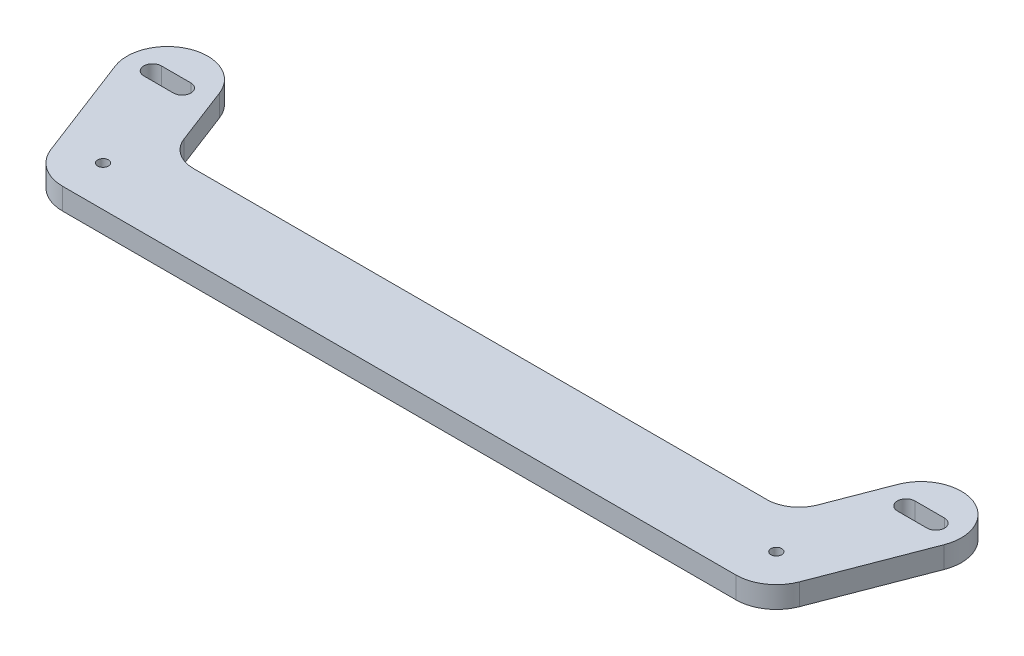
ISO-10303-21;
HEADER;
FILE_DESCRIPTION(('STEP AP214'),'2;1');
FILE_NAME('part.step','',(''),(''),'','','');
FILE_SCHEMA(('AUTOMOTIVE_DESIGN { 1 0 10303 214 1 1 1 1 }'));
ENDSEC;
DATA;
#1=APPLICATION_CONTEXT('core data for automotive mechanical design processes');
#2=APPLICATION_PROTOCOL_DEFINITION('international standard','automotive_design',2000,#1);
#3=PRODUCT_CONTEXT('',#1,'mechanical');
#4=PRODUCT('Part','Part','',(#3));
#5=PRODUCT_RELATED_PRODUCT_CATEGORY('part','',(#4));
#6=PRODUCT_DEFINITION_FORMATION('','',#4);
#7=PRODUCT_DEFINITION_CONTEXT('part definition',#1,'design');
#8=PRODUCT_DEFINITION('design','',#6,#7);
#9=PRODUCT_DEFINITION_SHAPE('','',#8);
#10=(LENGTH_UNIT() NAMED_UNIT(*) SI_UNIT(.MILLI.,.METRE.));
#11=(NAMED_UNIT(*) PLANE_ANGLE_UNIT() SI_UNIT($,.RADIAN.));
#12=(NAMED_UNIT(*) SI_UNIT($,.STERADIAN.) SOLID_ANGLE_UNIT());
#13=UNCERTAINTY_MEASURE_WITH_UNIT(LENGTH_MEASURE(1.E-05),#10,'distance_accuracy_value','');
#14=(GEOMETRIC_REPRESENTATION_CONTEXT(3) GLOBAL_UNCERTAINTY_ASSIGNED_CONTEXT((#13)) GLOBAL_UNIT_ASSIGNED_CONTEXT((#10,
#11,#12)) REPRESENTATION_CONTEXT('',''));
#15=CARTESIAN_POINT('',(0.,0.,0.));
#16=DIRECTION('',(0.,0.,1.));
#17=DIRECTION('',(1.,0.,0.));
#18=AXIS2_PLACEMENT_3D('',#15,#16,#17);
#19=CARTESIAN_POINT('',(106.4461265116,8.,-128.6));
#20=DIRECTION('',(0.,1.,0.));
#21=DIRECTION('',(0.,0.,1.));
#22=AXIS2_PLACEMENT_3D('',#19,#20,#21);
#23=PLANE('',#22);
#24=CARTESIAN_POINT('',(-125.,8.,-101.6));
#25=DIRECTION('',(0.,1.,0.));
#26=DIRECTION('',(0.,0.,1.));
#27=AXIS2_PLACEMENT_3D('',#24,#25,#26);
#28=CIRCLE('',#27,2.);
#29=CARTESIAN_POINT('',(-125.,8.,-99.6));
#30=VERTEX_POINT('',#29);
#31=EDGE_CURVE('E212',#30,#30,#28,.T.);
#32=ORIENTED_EDGE('',*,*,#31,.F.);
#33=EDGE_LOOP('',(#32));
#34=FACE_BOUND('',#33,.T.);
#35=CARTESIAN_POINT('',(106.4461265116,8.,-128.6));
#36=DIRECTION('',(0.,-1.,0.));
#37=DIRECTION('',(0.,0.,1.));
#38=AXIS2_PLACEMENT_3D('',#35,#36,#37);
#39=CIRCLE('',#38,12.);
#40=CARTESIAN_POINT('',(117.648504661635,8.,-124.298055813517));
#41=VERTEX_POINT('',#40);
#42=CARTESIAN_POINT('',(106.4461265116,8.,-116.6));
#43=VERTEX_POINT('',#42);
#44=EDGE_CURVE('E271',#41,#43,#39,.T.);
#45=ORIENTED_EDGE('',*,*,#44,.T.);
#46=DIRECTION('',(-1.,0.,0.));
#47=VECTOR('',#46,1.);
#48=CARTESIAN_POINT('',(-106.4461265116,8.,-116.6));
#49=LINE('',#48,#47);
#50=CARTESIAN_POINT('',(-106.4461265116,8.,-116.6));
#51=VERTEX_POINT('',#50);
#52=EDGE_CURVE('E275',#43,#51,#49,.T.);
#53=ORIENTED_EDGE('',*,*,#52,.T.);
#54=CARTESIAN_POINT('',(-106.4461265116,8.,-128.6));
#55=DIRECTION('',(0.,-1.,0.));
#56=DIRECTION('',(0.,0.,-1.));
#57=AXIS2_PLACEMENT_3D('',#54,#55,#56);
#58=CIRCLE('',#57,12.);
#59=CARTESIAN_POINT('',(-117.648504661636,8.,-124.298055813517));
#60=VERTEX_POINT('',#59);
#61=EDGE_CURVE('E279',#51,#60,#58,.T.);
#62=ORIENTED_EDGE('',*,*,#61,.T.);
#63=DIRECTION('',(-0.358495348873552,0.,-0.933531512502942));
#64=VECTOR('',#63,1.);
#65=CARTESIAN_POINT('',(-125.897027312456,8.,-145.777430233103));
#66=LINE('',#65,#64);
#67=CARTESIAN_POINT('',(-125.897027312456,8.,-145.777430233103));
#68=VERTEX_POINT('',#67);
#69=EDGE_CURVE('E282',#60,#68,#66,.T.);
#70=ORIENTED_EDGE('',*,*,#69,.T.);
#71=CARTESIAN_POINT('',(-139.9,8.,-140.4));
#72=DIRECTION('',(0.,1.,0.));
#73=DIRECTION('',(0.,0.,1.));
#74=AXIS2_PLACEMENT_3D('',#71,#72,#73);
#75=CIRCLE('',#74,15.);
#76=CARTESIAN_POINT('',(-153.902972687544,8.,-135.022569766897));
#77=VERTEX_POINT('',#76);
#78=EDGE_CURVE('E285',#68,#77,#75,.T.);
#79=ORIENTED_EDGE('',*,*,#78,.T.);
#80=DIRECTION('',(0.358495348873553,0.,0.933531512502941));
#81=VECTOR('',#80,1.);
#82=CARTESIAN_POINT('',(-153.902972687544,8.,-135.022569766897));
#83=LINE('',#82,#81);
#84=CARTESIAN_POINT('',(-139.002972687544,8.,-96.2225697668968));
#85=VERTEX_POINT('',#84);
#86=EDGE_CURVE('E288',#77,#85,#83,.T.);
#87=ORIENTED_EDGE('',*,*,#86,.T.);
#88=CARTESIAN_POINT('',(-125.,8.,-101.6));
#89=DIRECTION('',(0.,1.,0.));
#90=DIRECTION('',(0.,0.,1.));
#91=AXIS2_PLACEMENT_3D('',#88,#89,#90);
#92=CIRCLE('',#91,15.);
#93=CARTESIAN_POINT('',(-125.,8.,-86.6));
#94=VERTEX_POINT('',#93);
#95=EDGE_CURVE('E291',#85,#94,#92,.T.);
#96=ORIENTED_EDGE('',*,*,#95,.T.);
#97=DIRECTION('',(1.,0.,0.));
#98=VECTOR('',#97,1.);
#99=CARTESIAN_POINT('',(125.,8.,-86.6000000000001));
#100=LINE('',#99,#98);
#101=CARTESIAN_POINT('',(125.,8.,-86.6000000000001));
#102=VERTEX_POINT('',#101);
#103=EDGE_CURVE('E294',#94,#102,#100,.T.);
#104=ORIENTED_EDGE('',*,*,#103,.T.);
#105=CARTESIAN_POINT('',(125.,8.,-101.6));
#106=DIRECTION('',(0.,1.,0.));
#107=DIRECTION('',(0.,0.,1.));
#108=AXIS2_PLACEMENT_3D('',#105,#106,#107);
#109=CIRCLE('',#108,15.);
#110=CARTESIAN_POINT('',(139.002972687544,8.,-96.2225697668967));
#111=VERTEX_POINT('',#110);
#112=EDGE_CURVE('E297',#102,#111,#109,.T.);
#113=ORIENTED_EDGE('',*,*,#112,.T.);
#114=DIRECTION('',(0.358495348873553,0.,-0.933531512502941));
#115=VECTOR('',#114,1.);
#116=CARTESIAN_POINT('',(139.002972687544,8.,-96.2225697668967));
#117=LINE('',#116,#115);
#118=CARTESIAN_POINT('',(153.902972687544,8.,-135.022569766897));
#119=VERTEX_POINT('',#118);
#120=EDGE_CURVE('E300',#111,#119,#117,.T.);
#121=ORIENTED_EDGE('',*,*,#120,.T.);
#122=CARTESIAN_POINT('',(139.9,8.,-140.4));
#123=DIRECTION('',(0.,1.,0.));
#124=DIRECTION('',(0.,0.,1.));
#125=AXIS2_PLACEMENT_3D('',#122,#123,#124);
#126=CIRCLE('',#125,15.);
#127=CARTESIAN_POINT('',(125.897027312456,8.,-145.777430233103));
#128=VERTEX_POINT('',#127);
#129=EDGE_CURVE('E303',#119,#128,#126,.T.);
#130=ORIENTED_EDGE('',*,*,#129,.T.);
#131=DIRECTION('',(-0.358495348873552,0.,0.933531512502942));
#132=VECTOR('',#131,1.);
#133=CARTESIAN_POINT('',(117.648504661635,8.,-124.298055813517));
#134=LINE('',#133,#132);
#135=EDGE_CURVE('E306',#128,#41,#134,.T.);
#136=ORIENTED_EDGE('',*,*,#135,.T.);
#137=EDGE_LOOP('',(#45,#53,#62,#70,#79,#87,#96,#104,#113,#121,#130,#136));
#138=FACE_BOUND('',#137,.T.);
#139=DIRECTION('',(1.,0.,0.));
#140=VECTOR('',#139,1.);
#141=CARTESIAN_POINT('',(-145.4,8.,-137.15));
#142=LINE('',#141,#140);
#143=CARTESIAN_POINT('',(-145.4,8.,-137.15));
#144=VERTEX_POINT('',#143);
#145=CARTESIAN_POINT('',(-134.4,8.,-137.15));
#146=VERTEX_POINT('',#145);
#147=EDGE_CURVE('E231',#144,#146,#142,.T.);
#148=ORIENTED_EDGE('',*,*,#147,.F.);
#149=CARTESIAN_POINT('',(-145.4,8.,-140.4));
#150=DIRECTION('',(0.,1.,0.));
#151=DIRECTION('',(0.,0.,1.));
#152=AXIS2_PLACEMENT_3D('',#149,#150,#151);
#153=CIRCLE('',#152,3.25);
#154=CARTESIAN_POINT('',(-145.4,8.,-143.65));
#155=VERTEX_POINT('',#154);
#156=EDGE_CURVE('E228',#155,#144,#153,.T.);
#157=ORIENTED_EDGE('',*,*,#156,.F.);
#158=DIRECTION('',(-1.,0.,0.));
#159=VECTOR('',#158,1.);
#160=CARTESIAN_POINT('',(-145.4,8.,-143.65));
#161=LINE('',#160,#159);
#162=CARTESIAN_POINT('',(-134.4,8.,-143.65));
#163=VERTEX_POINT('',#162);
#164=EDGE_CURVE('E239',#163,#155,#161,.T.);
#165=ORIENTED_EDGE('',*,*,#164,.F.);
#166=CARTESIAN_POINT('',(-134.4,8.,-140.4));
#167=DIRECTION('',(0.,1.,0.));
#168=DIRECTION('',(0.,0.,1.));
#169=AXIS2_PLACEMENT_3D('',#166,#167,#168);
#170=CIRCLE('',#169,3.25);
#171=EDGE_CURVE('E235',#146,#163,#170,.T.);
#172=ORIENTED_EDGE('',*,*,#171,.F.);
#173=EDGE_LOOP('',(#148,#157,#165,#172));
#174=FACE_BOUND('',#173,.T.);
#175=DIRECTION('',(-1.,0.,0.));
#176=VECTOR('',#175,1.);
#177=CARTESIAN_POINT('',(145.4,8.,-143.65));
#178=LINE('',#177,#176);
#179=CARTESIAN_POINT('',(145.4,8.,-143.65));
#180=VERTEX_POINT('',#179);
#181=CARTESIAN_POINT('',(134.4,8.,-143.65));
#182=VERTEX_POINT('',#181);
#183=EDGE_CURVE('E186',#180,#182,#178,.T.);
#184=ORIENTED_EDGE('',*,*,#183,.F.);
#185=CARTESIAN_POINT('',(145.4,8.,-140.4));
#186=DIRECTION('',(0.,1.,0.));
#187=DIRECTION('',(0.,0.,1.));
#188=AXIS2_PLACEMENT_3D('',#185,#186,#187);
#189=CIRCLE('',#188,3.25);
#190=CARTESIAN_POINT('',(145.4,8.,-137.15));
#191=VERTEX_POINT('',#190);
#192=EDGE_CURVE('E177',#191,#180,#189,.T.);
#193=ORIENTED_EDGE('',*,*,#192,.F.);
#194=DIRECTION('',(1.,0.,0.));
#195=VECTOR('',#194,1.);
#196=CARTESIAN_POINT('',(145.4,8.,-137.15));
#197=LINE('',#196,#195);
#198=CARTESIAN_POINT('',(134.4,8.,-137.15));
#199=VERTEX_POINT('',#198);
#200=EDGE_CURVE('E204',#199,#191,#197,.T.);
#201=ORIENTED_EDGE('',*,*,#200,.F.);
#202=CARTESIAN_POINT('',(134.4,8.,-140.4));
#203=DIRECTION('',(0.,1.,0.));
#204=DIRECTION('',(0.,0.,1.));
#205=AXIS2_PLACEMENT_3D('',#202,#203,#204);
#206=CIRCLE('',#205,3.25);
#207=EDGE_CURVE('E200',#182,#199,#206,.T.);
#208=ORIENTED_EDGE('',*,*,#207,.F.);
#209=EDGE_LOOP('',(#184,#193,#201,#208));
#210=FACE_BOUND('',#209,.T.);
#211=CARTESIAN_POINT('',(125.,8.,-101.6));
#212=DIRECTION('',(0.,1.,0.));
#213=DIRECTION('',(0.,0.,1.));
#214=AXIS2_PLACEMENT_3D('',#211,#212,#213);
#215=CIRCLE('',#214,1.99999999999998);
#216=CARTESIAN_POINT('',(125.,8.,-99.6));
#217=VERTEX_POINT('',#216);
#218=EDGE_CURVE('E658',#217,#217,#215,.T.);
#219=ORIENTED_EDGE('',*,*,#218,.F.);
#220=EDGE_LOOP('',(#219));
#221=FACE_BOUND('',#220,.T.);
#222=ADVANCED_FACE('F39',(#34,#138,#174,#210,#221),#23,.T.);
#223=CARTESIAN_POINT('',(106.4461265116,0.,-128.6));
#224=DIRECTION('',(0.,1.,0.));
#225=DIRECTION('',(0.,0.,1.));
#226=AXIS2_PLACEMENT_3D('',#223,#224,#225);
#227=PLANE('',#226);
#228=CARTESIAN_POINT('',(-145.4,0.,-140.4));
#229=DIRECTION('',(0.,1.,0.));
#230=DIRECTION('',(0.,0.,1.));
#231=AXIS2_PLACEMENT_3D('',#228,#229,#230);
#232=CIRCLE('',#231,3.25);
#233=CARTESIAN_POINT('',(-145.4,0.,-143.65));
#234=VERTEX_POINT('',#233);
#235=CARTESIAN_POINT('',(-145.4,0.,-137.15));
#236=VERTEX_POINT('',#235);
#237=EDGE_CURVE('E195',#234,#236,#232,.T.);
#238=ORIENTED_EDGE('',*,*,#237,.T.);
#239=DIRECTION('',(1.,0.,0.));
#240=VECTOR('',#239,1.);
#241=CARTESIAN_POINT('',(-145.4,0.,-137.15));
#242=LINE('',#241,#240);
#243=CARTESIAN_POINT('',(-134.4,0.,-137.15));
#244=VERTEX_POINT('',#243);
#245=EDGE_CURVE('E246',#236,#244,#242,.T.);
#246=ORIENTED_EDGE('',*,*,#245,.T.);
#247=CARTESIAN_POINT('',(-134.4,0.,-140.4));
#248=DIRECTION('',(0.,1.,0.));
#249=DIRECTION('',(0.,0.,1.));
#250=AXIS2_PLACEMENT_3D('',#247,#248,#249);
#251=CIRCLE('',#250,3.25);
#252=CARTESIAN_POINT('',(-134.4,0.,-143.65));
#253=VERTEX_POINT('',#252);
#254=EDGE_CURVE('E250',#244,#253,#251,.T.);
#255=ORIENTED_EDGE('',*,*,#254,.T.);
#256=DIRECTION('',(-1.,0.,0.));
#257=VECTOR('',#256,1.);
#258=CARTESIAN_POINT('',(-145.4,0.,-143.65));
#259=LINE('',#258,#257);
#260=EDGE_CURVE('E232',#253,#234,#259,.T.);
#261=ORIENTED_EDGE('',*,*,#260,.T.);
#262=EDGE_LOOP('',(#238,#246,#255,#261));
#263=FACE_BOUND('',#262,.T.);
#264=CARTESIAN_POINT('',(106.4461265116,0.,-128.6));
#265=DIRECTION('',(0.,-1.,0.));
#266=DIRECTION('',(0.,0.,1.));
#267=AXIS2_PLACEMENT_3D('',#264,#265,#266);
#268=CIRCLE('',#267,12.);
#269=CARTESIAN_POINT('',(117.648504661635,0.,-124.298055813517));
#270=VERTEX_POINT('',#269);
#271=CARTESIAN_POINT('',(106.4461265116,0.,-116.6));
#272=VERTEX_POINT('',#271);
#273=EDGE_CURVE('E270',#270,#272,#268,.T.);
#274=ORIENTED_EDGE('',*,*,#273,.F.);
#275=DIRECTION('',(-0.358495348873552,0.,0.933531512502942));
#276=VECTOR('',#275,1.);
#277=CARTESIAN_POINT('',(117.648504661635,0.,-124.298055813517));
#278=LINE('',#277,#276);
#279=CARTESIAN_POINT('',(125.897027312456,0.,-145.777430233103));
#280=VERTEX_POINT('',#279);
#281=EDGE_CURVE('E276',#280,#270,#278,.T.);
#282=ORIENTED_EDGE('',*,*,#281,.F.);
#283=CARTESIAN_POINT('',(139.9,0.,-140.4));
#284=DIRECTION('',(0.,1.,0.));
#285=DIRECTION('',(0.,0.,1.));
#286=AXIS2_PLACEMENT_3D('',#283,#284,#285);
#287=CIRCLE('',#286,15.);
#288=CARTESIAN_POINT('',(153.902972687544,0.,-135.022569766897));
#289=VERTEX_POINT('',#288);
#290=EDGE_CURVE('E340',#289,#280,#287,.T.);
#291=ORIENTED_EDGE('',*,*,#290,.F.);
#292=DIRECTION('',(0.358495348873553,0.,-0.933531512502941));
#293=VECTOR('',#292,1.);
#294=CARTESIAN_POINT('',(139.002972687544,0.,-96.2225697668967));
#295=LINE('',#294,#293);
#296=CARTESIAN_POINT('',(139.002972687544,0.,-96.2225697668967));
#297=VERTEX_POINT('',#296);
#298=EDGE_CURVE('E337',#297,#289,#295,.T.);
#299=ORIENTED_EDGE('',*,*,#298,.F.);
#300=CARTESIAN_POINT('',(125.,0.,-101.6));
#301=DIRECTION('',(0.,1.,0.));
#302=DIRECTION('',(0.,0.,1.));
#303=AXIS2_PLACEMENT_3D('',#300,#301,#302);
#304=CIRCLE('',#303,15.);
#305=CARTESIAN_POINT('',(125.,0.,-86.6000000000001));
#306=VERTEX_POINT('',#305);
#307=EDGE_CURVE('E334',#306,#297,#304,.T.);
#308=ORIENTED_EDGE('',*,*,#307,.F.);
#309=DIRECTION('',(1.,0.,0.));
#310=VECTOR('',#309,1.);
#311=CARTESIAN_POINT('',(125.,0.,-86.6000000000001));
#312=LINE('',#311,#310);
#313=CARTESIAN_POINT('',(-125.,0.,-86.6));
#314=VERTEX_POINT('',#313);
#315=EDGE_CURVE('E331',#314,#306,#312,.T.);
#316=ORIENTED_EDGE('',*,*,#315,.F.);
#317=CARTESIAN_POINT('',(-125.,0.,-101.6));
#318=DIRECTION('',(0.,1.,0.));
#319=DIRECTION('',(0.,0.,1.));
#320=AXIS2_PLACEMENT_3D('',#317,#318,#319);
#321=CIRCLE('',#320,15.);
#322=CARTESIAN_POINT('',(-139.002972687544,0.,-96.2225697668968));
#323=VERTEX_POINT('',#322);
#324=EDGE_CURVE('E328',#323,#314,#321,.T.);
#325=ORIENTED_EDGE('',*,*,#324,.F.);
#326=DIRECTION('',(0.358495348873553,0.,0.933531512502941));
#327=VECTOR('',#326,1.);
#328=CARTESIAN_POINT('',(-153.902972687544,0.,-135.022569766897));
#329=LINE('',#328,#327);
#330=CARTESIAN_POINT('',(-153.902972687544,0.,-135.022569766897));
#331=VERTEX_POINT('',#330);
#332=EDGE_CURVE('E325',#331,#323,#329,.T.);
#333=ORIENTED_EDGE('',*,*,#332,.F.);
#334=CARTESIAN_POINT('',(-139.9,0.,-140.4));
#335=DIRECTION('',(0.,1.,0.));
#336=DIRECTION('',(0.,0.,1.));
#337=AXIS2_PLACEMENT_3D('',#334,#335,#336);
#338=CIRCLE('',#337,15.);
#339=CARTESIAN_POINT('',(-125.897027312456,0.,-145.777430233103));
#340=VERTEX_POINT('',#339);
#341=EDGE_CURVE('E322',#340,#331,#338,.T.);
#342=ORIENTED_EDGE('',*,*,#341,.F.);
#343=DIRECTION('',(-0.358495348873552,0.,-0.933531512502942));
#344=VECTOR('',#343,1.);
#345=CARTESIAN_POINT('',(-125.897027312456,0.,-145.777430233103));
#346=LINE('',#345,#344);
#347=CARTESIAN_POINT('',(-117.648504661636,0.,-124.298055813517));
#348=VERTEX_POINT('',#347);
#349=EDGE_CURVE('E319',#348,#340,#346,.T.);
#350=ORIENTED_EDGE('',*,*,#349,.F.);
#351=CARTESIAN_POINT('',(-106.4461265116,0.,-128.6));
#352=DIRECTION('',(0.,-1.,0.));
#353=DIRECTION('',(0.,0.,-1.));
#354=AXIS2_PLACEMENT_3D('',#351,#352,#353);
#355=CIRCLE('',#354,12.);
#356=CARTESIAN_POINT('',(-106.4461265116,0.,-116.6));
#357=VERTEX_POINT('',#356);
#358=EDGE_CURVE('E316',#357,#348,#355,.T.);
#359=ORIENTED_EDGE('',*,*,#358,.F.);
#360=DIRECTION('',(-1.,0.,0.));
#361=VECTOR('',#360,1.);
#362=CARTESIAN_POINT('',(-106.4461265116,0.,-116.6));
#363=LINE('',#362,#361);
#364=EDGE_CURVE('E313',#272,#357,#363,.T.);
#365=ORIENTED_EDGE('',*,*,#364,.F.);
#366=EDGE_LOOP('',(#274,#282,#291,#299,#308,#316,#325,#333,#342,#350,#359,#365));
#367=FACE_BOUND('',#366,.T.);
#368=CARTESIAN_POINT('',(145.4,0.,-140.4));
#369=DIRECTION('',(0.,1.,0.));
#370=DIRECTION('',(0.,0.,1.));
#371=AXIS2_PLACEMENT_3D('',#368,#369,#370);
#372=CIRCLE('',#371,3.25);
#373=CARTESIAN_POINT('',(145.4,0.,-137.15));
#374=VERTEX_POINT('',#373);
#375=CARTESIAN_POINT('',(145.4,0.,-143.65));
#376=VERTEX_POINT('',#375);
#377=EDGE_CURVE('E63',#374,#376,#372,.T.);
#378=ORIENTED_EDGE('',*,*,#377,.T.);
#379=DIRECTION('',(-1.,0.,0.));
#380=VECTOR('',#379,1.);
#381=CARTESIAN_POINT('',(145.4,0.,-143.65));
#382=LINE('',#381,#380);
#383=CARTESIAN_POINT('',(134.4,0.,-143.65));
#384=VERTEX_POINT('',#383);
#385=EDGE_CURVE('E193',#376,#384,#382,.T.);
#386=ORIENTED_EDGE('',*,*,#385,.T.);
#387=CARTESIAN_POINT('',(134.4,0.,-140.4));
#388=DIRECTION('',(0.,1.,0.));
#389=DIRECTION('',(0.,0.,1.));
#390=AXIS2_PLACEMENT_3D('',#387,#388,#389);
#391=CIRCLE('',#390,3.25);
#392=CARTESIAN_POINT('',(134.4,0.,-137.15));
#393=VERTEX_POINT('',#392);
#394=EDGE_CURVE('E215',#384,#393,#391,.T.);
#395=ORIENTED_EDGE('',*,*,#394,.T.);
#396=DIRECTION('',(1.,0.,0.));
#397=VECTOR('',#396,1.);
#398=CARTESIAN_POINT('',(145.4,0.,-137.15));
#399=LINE('',#398,#397);
#400=EDGE_CURVE('E187',#393,#374,#399,.T.);
#401=ORIENTED_EDGE('',*,*,#400,.T.);
#402=EDGE_LOOP('',(#378,#386,#395,#401));
#403=FACE_BOUND('',#402,.T.);
#404=CARTESIAN_POINT('',(-125.,0.,-101.6));
#405=DIRECTION('',(0.,1.,0.));
#406=DIRECTION('',(0.,0.,1.));
#407=AXIS2_PLACEMENT_3D('',#404,#405,#406);
#408=CIRCLE('',#407,2.);
#409=CARTESIAN_POINT('',(-125.,0.,-99.6));
#410=VERTEX_POINT('',#409);
#411=EDGE_CURVE('E666',#410,#410,#408,.T.);
#412=ORIENTED_EDGE('',*,*,#411,.T.);
#413=EDGE_LOOP('',(#412));
#414=FACE_BOUND('',#413,.T.);
#415=CARTESIAN_POINT('',(125.,0.,-101.6));
#416=DIRECTION('',(0.,1.,0.));
#417=DIRECTION('',(0.,0.,1.));
#418=AXIS2_PLACEMENT_3D('',#415,#416,#417);
#419=CIRCLE('',#418,1.99999999999998);
#420=CARTESIAN_POINT('',(125.,0.,-99.6));
#421=VERTEX_POINT('',#420);
#422=EDGE_CURVE('E661',#421,#421,#419,.T.);
#423=ORIENTED_EDGE('',*,*,#422,.T.);
#424=EDGE_LOOP('',(#423));
#425=FACE_BOUND('',#424,.T.);
#426=ADVANCED_FACE('F395',(#263,#367,#403,#414,#425),#227,.F.);
#427=CARTESIAN_POINT('',(106.4461265116,8.,-128.6));
#428=DIRECTION('',(0.,-1.,0.));
#429=DIRECTION('',(0.,0.,-1.));
#430=AXIS2_PLACEMENT_3D('',#427,#428,#429);
#431=CYLINDRICAL_SURFACE('',#430,12.);
#432=ORIENTED_EDGE('',*,*,#273,.T.);
#433=DIRECTION('',(0.,-1.,0.));
#434=VECTOR('',#433,1.);
#435=CARTESIAN_POINT('',(106.4461265116,8.,-116.6));
#436=LINE('',#435,#434);
#437=EDGE_CURVE('E11',#43,#272,#436,.T.);
#438=ORIENTED_EDGE('',*,*,#437,.F.);
#439=ORIENTED_EDGE('',*,*,#44,.F.);
#440=DIRECTION('',(0.,-1.,0.));
#441=VECTOR('',#440,1.);
#442=CARTESIAN_POINT('',(117.648504661635,8.,-124.298055813517));
#443=LINE('',#442,#441);
#444=EDGE_CURVE('E309',#41,#270,#443,.T.);
#445=ORIENTED_EDGE('',*,*,#444,.T.);
#446=EDGE_LOOP('',(#432,#438,#439,#445));
#447=FACE_BOUND('',#446,.T.);
#448=ADVANCED_FACE('F41',(#447),#431,.F.);
#449=CARTESIAN_POINT('',(-106.4461265116,8.,-116.6));
#450=DIRECTION('',(0.,0.,1.));
#451=DIRECTION('',(1.,0.,0.));
#452=AXIS2_PLACEMENT_3D('',#449,#450,#451);
#453=PLANE('',#452);
#454=ORIENTED_EDGE('',*,*,#364,.T.);
#455=DIRECTION('',(0.,-1.,0.));
#456=VECTOR('',#455,1.);
#457=CARTESIAN_POINT('',(-106.4461265116,8.,-116.6));
#458=LINE('',#457,#456);
#459=EDGE_CURVE('E48',#51,#357,#458,.T.);
#460=ORIENTED_EDGE('',*,*,#459,.F.);
#461=ORIENTED_EDGE('',*,*,#52,.F.);
#462=ORIENTED_EDGE('',*,*,#437,.T.);
#463=EDGE_LOOP('',(#454,#460,#461,#462));
#464=FACE_BOUND('',#463,.T.);
#465=ADVANCED_FACE('F413',(#464),#453,.F.);
#466=CARTESIAN_POINT('',(-106.4461265116,8.,-128.6));
#467=DIRECTION('',(0.,-1.,0.));
#468=DIRECTION('',(0.,0.,-1.));
#469=AXIS2_PLACEMENT_3D('',#466,#467,#468);
#470=CYLINDRICAL_SURFACE('',#469,12.);
#471=ORIENTED_EDGE('',*,*,#358,.T.);
#472=DIRECTION('',(0.,-1.,0.));
#473=VECTOR('',#472,1.);
#474=CARTESIAN_POINT('',(-117.648504661636,8.,-124.298055813517));
#475=LINE('',#474,#473);
#476=EDGE_CURVE('E380',#60,#348,#475,.T.);
#477=ORIENTED_EDGE('',*,*,#476,.F.);
#478=ORIENTED_EDGE('',*,*,#61,.F.);
#479=ORIENTED_EDGE('',*,*,#459,.T.);
#480=EDGE_LOOP('',(#471,#477,#478,#479));
#481=FACE_BOUND('',#480,.T.);
#482=ADVANCED_FACE('F389',(#481),#470,.F.);
#483=CARTESIAN_POINT('',(-125.897027312456,8.,-145.777430233103));
#484=DIRECTION('',(-0.933531512502942,0.,0.358495348873552));
#485=DIRECTION('',(0.358495348873552,0.,0.933531512502942));
#486=AXIS2_PLACEMENT_3D('',#483,#484,#485);
#487=PLANE('',#486);
#488=ORIENTED_EDGE('',*,*,#349,.T.);
#489=DIRECTION('',(0.,-1.,0.));
#490=VECTOR('',#489,1.);
#491=CARTESIAN_POINT('',(-125.897027312456,8.,-145.777430233103));
#492=LINE('',#491,#490);
#493=EDGE_CURVE('E376',#68,#340,#492,.T.);
#494=ORIENTED_EDGE('',*,*,#493,.F.);
#495=ORIENTED_EDGE('',*,*,#69,.F.);
#496=ORIENTED_EDGE('',*,*,#476,.T.);
#497=EDGE_LOOP('',(#488,#494,#495,#496));
#498=FACE_BOUND('',#497,.T.);
#499=ADVANCED_FACE('F401',(#498),#487,.F.);
#500=CARTESIAN_POINT('',(-139.9,8.,-140.4));
#501=DIRECTION('',(0.,-1.,0.));
#502=DIRECTION('',(0.,0.,-1.));
#503=AXIS2_PLACEMENT_3D('',#500,#501,#502);
#504=CYLINDRICAL_SURFACE('',#503,15.);
#505=ORIENTED_EDGE('',*,*,#341,.T.);
#506=DIRECTION('',(0.,-1.,0.));
#507=VECTOR('',#506,1.);
#508=CARTESIAN_POINT('',(-153.902972687544,8.,-135.022569766897));
#509=LINE('',#508,#507);
#510=EDGE_CURVE('E372',#77,#331,#509,.T.);
#511=ORIENTED_EDGE('',*,*,#510,.F.);
#512=ORIENTED_EDGE('',*,*,#78,.F.);
#513=ORIENTED_EDGE('',*,*,#493,.T.);
#514=EDGE_LOOP('',(#505,#511,#512,#513));
#515=FACE_BOUND('',#514,.T.);
#516=ADVANCED_FACE('F405',(#515),#504,.T.);
#517=CARTESIAN_POINT('',(-153.902972687544,8.,-135.022569766897));
#518=DIRECTION('',(0.933531512502942,0.,-0.358495348873553));
#519=DIRECTION('',(-0.358495348873553,0.,-0.933531512502942));
#520=AXIS2_PLACEMENT_3D('',#517,#518,#519);
#521=PLANE('',#520);
#522=ORIENTED_EDGE('',*,*,#332,.T.);
#523=DIRECTION('',(0.,-1.,0.));
#524=VECTOR('',#523,1.);
#525=CARTESIAN_POINT('',(-139.002972687544,8.,-96.2225697668968));
#526=LINE('',#525,#524);
#527=EDGE_CURVE('E368',#85,#323,#526,.T.);
#528=ORIENTED_EDGE('',*,*,#527,.F.);
#529=ORIENTED_EDGE('',*,*,#86,.F.);
#530=ORIENTED_EDGE('',*,*,#510,.T.);
#531=EDGE_LOOP('',(#522,#528,#529,#530));
#532=FACE_BOUND('',#531,.T.);
#533=ADVANCED_FACE('F446',(#532),#521,.F.);
#534=CARTESIAN_POINT('',(-125.,8.,-101.6));
#535=DIRECTION('',(0.,-1.,0.));
#536=DIRECTION('',(0.,0.,-1.));
#537=AXIS2_PLACEMENT_3D('',#534,#535,#536);
#538=CYLINDRICAL_SURFACE('',#537,15.);
#539=ORIENTED_EDGE('',*,*,#324,.T.);
#540=DIRECTION('',(0.,-1.,0.));
#541=VECTOR('',#540,1.);
#542=CARTESIAN_POINT('',(-125.,8.,-86.6));
#543=LINE('',#542,#541);
#544=EDGE_CURVE('E364',#94,#314,#543,.T.);
#545=ORIENTED_EDGE('',*,*,#544,.F.);
#546=ORIENTED_EDGE('',*,*,#95,.F.);
#547=ORIENTED_EDGE('',*,*,#527,.T.);
#548=EDGE_LOOP('',(#539,#545,#546,#547));
#549=FACE_BOUND('',#548,.T.);
#550=ADVANCED_FACE('F444',(#549),#538,.T.);
#551=CARTESIAN_POINT('',(125.,8.,-86.6000000000001));
#552=DIRECTION('',(0.,0.,-1.));
#553=DIRECTION('',(-1.,0.,0.));
#554=AXIS2_PLACEMENT_3D('',#551,#552,#553);
#555=PLANE('',#554);
#556=ORIENTED_EDGE('',*,*,#315,.T.);
#557=DIRECTION('',(0.,-1.,0.));
#558=VECTOR('',#557,1.);
#559=CARTESIAN_POINT('',(125.,8.,-86.6000000000001));
#560=LINE('',#559,#558);
#561=EDGE_CURVE('E360',#102,#306,#560,.T.);
#562=ORIENTED_EDGE('',*,*,#561,.F.);
#563=ORIENTED_EDGE('',*,*,#103,.F.);
#564=ORIENTED_EDGE('',*,*,#544,.T.);
#565=EDGE_LOOP('',(#556,#562,#563,#564));
#566=FACE_BOUND('',#565,.T.);
#567=ADVANCED_FACE('F440',(#566),#555,.F.);
#568=CARTESIAN_POINT('',(125.,8.,-101.6));
#569=DIRECTION('',(0.,-1.,0.));
#570=DIRECTION('',(0.,0.,-1.));
#571=AXIS2_PLACEMENT_3D('',#568,#569,#570);
#572=CYLINDRICAL_SURFACE('',#571,15.);
#573=ORIENTED_EDGE('',*,*,#307,.T.);
#574=DIRECTION('',(0.,-1.,0.));
#575=VECTOR('',#574,1.);
#576=CARTESIAN_POINT('',(139.002972687544,8.,-96.2225697668967));
#577=LINE('',#576,#575);
#578=EDGE_CURVE('E356',#111,#297,#577,.T.);
#579=ORIENTED_EDGE('',*,*,#578,.F.);
#580=ORIENTED_EDGE('',*,*,#112,.F.);
#581=ORIENTED_EDGE('',*,*,#561,.T.);
#582=EDGE_LOOP('',(#573,#579,#580,#581));
#583=FACE_BOUND('',#582,.T.);
#584=ADVANCED_FACE('F435',(#583),#572,.T.);
#585=CARTESIAN_POINT('',(139.002972687544,8.,-96.2225697668967));
#586=DIRECTION('',(-0.933531512502942,0.,-0.358495348873553));
#587=DIRECTION('',(-0.358495348873553,0.,0.933531512502942));
#588=AXIS2_PLACEMENT_3D('',#585,#586,#587);
#589=PLANE('',#588);
#590=ORIENTED_EDGE('',*,*,#298,.T.);
#591=DIRECTION('',(0.,-1.,0.));
#592=VECTOR('',#591,1.);
#593=CARTESIAN_POINT('',(153.902972687544,8.,-135.022569766897));
#594=LINE('',#593,#592);
#595=EDGE_CURVE('E352',#119,#289,#594,.T.);
#596=ORIENTED_EDGE('',*,*,#595,.F.);
#597=ORIENTED_EDGE('',*,*,#120,.F.);
#598=ORIENTED_EDGE('',*,*,#578,.T.);
#599=EDGE_LOOP('',(#590,#596,#597,#598));
#600=FACE_BOUND('',#599,.T.);
#601=ADVANCED_FACE('F429',(#600),#589,.F.);
#602=CARTESIAN_POINT('',(139.9,8.,-140.4));
#603=DIRECTION('',(0.,-1.,0.));
#604=DIRECTION('',(0.,0.,-1.));
#605=AXIS2_PLACEMENT_3D('',#602,#603,#604);
#606=CYLINDRICAL_SURFACE('',#605,15.);
#607=ORIENTED_EDGE('',*,*,#290,.T.);
#608=DIRECTION('',(0.,-1.,0.));
#609=VECTOR('',#608,1.);
#610=CARTESIAN_POINT('',(125.897027312456,8.,-145.777430233103));
#611=LINE('',#610,#609);
#612=EDGE_CURVE('E348',#128,#280,#611,.T.);
#613=ORIENTED_EDGE('',*,*,#612,.F.);
#614=ORIENTED_EDGE('',*,*,#129,.F.);
#615=ORIENTED_EDGE('',*,*,#595,.T.);
#616=EDGE_LOOP('',(#607,#613,#614,#615));
#617=FACE_BOUND('',#616,.T.);
#618=ADVANCED_FACE('F425',(#617),#606,.T.);
#619=CARTESIAN_POINT('',(117.648504661635,8.,-124.298055813517));
#620=DIRECTION('',(0.933531512502942,0.,0.358495348873552));
#621=DIRECTION('',(0.358495348873552,0.,-0.933531512502942));
#622=AXIS2_PLACEMENT_3D('',#619,#620,#621);
#623=PLANE('',#622);
#624=ORIENTED_EDGE('',*,*,#281,.T.);
#625=ORIENTED_EDGE('',*,*,#444,.F.);
#626=ORIENTED_EDGE('',*,*,#135,.F.);
#627=ORIENTED_EDGE('',*,*,#612,.T.);
#628=EDGE_LOOP('',(#624,#625,#626,#627));
#629=FACE_BOUND('',#628,.T.);
#630=ADVANCED_FACE('F420',(#629),#623,.F.);
#631=CARTESIAN_POINT('',(-145.4,8.,-140.4));
#632=DIRECTION('',(0.,-1.,0.));
#633=DIRECTION('',(0.,0.,-1.));
#634=AXIS2_PLACEMENT_3D('',#631,#632,#633);
#635=CYLINDRICAL_SURFACE('',#634,3.25);
#636=ORIENTED_EDGE('',*,*,#237,.F.);
#637=DIRECTION('',(0.,-1.,0.));
#638=VECTOR('',#637,1.);
#639=CARTESIAN_POINT('',(-145.4,8.,-143.65));
#640=LINE('',#639,#638);
#641=EDGE_CURVE('E242',#155,#234,#640,.T.);
#642=ORIENTED_EDGE('',*,*,#641,.F.);
#643=ORIENTED_EDGE('',*,*,#156,.T.);
#644=DIRECTION('',(0.,-1.,0.));
#645=VECTOR('',#644,1.);
#646=CARTESIAN_POINT('',(-145.4,8.,-137.15));
#647=LINE('',#646,#645);
#648=EDGE_CURVE('E266',#144,#236,#647,.T.);
#649=ORIENTED_EDGE('',*,*,#648,.T.);
#650=EDGE_LOOP('',(#636,#642,#643,#649));
#651=FACE_BOUND('',#650,.T.);
#652=ADVANCED_FACE('F465',(#651),#635,.F.);
#653=CARTESIAN_POINT('',(-145.4,8.,-137.15));
#654=DIRECTION('',(0.,0.,-1.));
#655=DIRECTION('',(-1.,0.,0.));
#656=AXIS2_PLACEMENT_3D('',#653,#654,#655);
#657=PLANE('',#656);
#658=ORIENTED_EDGE('',*,*,#245,.F.);
#659=ORIENTED_EDGE('',*,*,#648,.F.);
#660=ORIENTED_EDGE('',*,*,#147,.T.);
#661=DIRECTION('',(0.,-1.,0.));
#662=VECTOR('',#661,1.);
#663=CARTESIAN_POINT('',(-134.4,8.,-137.15));
#664=LINE('',#663,#662);
#665=EDGE_CURVE('E263',#146,#244,#664,.T.);
#666=ORIENTED_EDGE('',*,*,#665,.T.);
#667=EDGE_LOOP('',(#658,#659,#660,#666));
#668=FACE_BOUND('',#667,.T.);
#669=ADVANCED_FACE('F503',(#668),#657,.T.);
#670=CARTESIAN_POINT('',(-134.4,8.,-140.4));
#671=DIRECTION('',(0.,-1.,0.));
#672=DIRECTION('',(0.,0.,-1.));
#673=AXIS2_PLACEMENT_3D('',#670,#671,#672);
#674=CYLINDRICAL_SURFACE('',#673,3.25);
#675=ORIENTED_EDGE('',*,*,#254,.F.);
#676=ORIENTED_EDGE('',*,*,#665,.F.);
#677=ORIENTED_EDGE('',*,*,#171,.T.);
#678=DIRECTION('',(0.,-1.,0.));
#679=VECTOR('',#678,1.);
#680=CARTESIAN_POINT('',(-134.4,8.,-143.65));
#681=LINE('',#680,#679);
#682=EDGE_CURVE('E260',#163,#253,#681,.T.);
#683=ORIENTED_EDGE('',*,*,#682,.T.);
#684=EDGE_LOOP('',(#675,#676,#677,#683));
#685=FACE_BOUND('',#684,.T.);
#686=ADVANCED_FACE('F510',(#685),#674,.F.);
#687=CARTESIAN_POINT('',(-145.4,8.,-143.65));
#688=DIRECTION('',(0.,0.,1.));
#689=DIRECTION('',(1.,0.,0.));
#690=AXIS2_PLACEMENT_3D('',#687,#688,#689);
#691=PLANE('',#690);
#692=ORIENTED_EDGE('',*,*,#260,.F.);
#693=ORIENTED_EDGE('',*,*,#682,.F.);
#694=ORIENTED_EDGE('',*,*,#164,.T.);
#695=ORIENTED_EDGE('',*,*,#641,.T.);
#696=EDGE_LOOP('',(#692,#693,#694,#695));
#697=FACE_BOUND('',#696,.T.);
#698=ADVANCED_FACE('F517',(#697),#691,.T.);
#699=CARTESIAN_POINT('',(145.4,8.,-140.4));
#700=DIRECTION('',(0.,-1.,0.));
#701=DIRECTION('',(0.,0.,-1.));
#702=AXIS2_PLACEMENT_3D('',#699,#700,#701);
#703=CYLINDRICAL_SURFACE('',#702,3.25);
#704=ORIENTED_EDGE('',*,*,#377,.F.);
#705=DIRECTION('',(0.,-1.,0.));
#706=VECTOR('',#705,1.);
#707=CARTESIAN_POINT('',(145.4,8.,-137.15));
#708=LINE('',#707,#706);
#709=EDGE_CURVE('E181',#191,#374,#708,.T.);
#710=ORIENTED_EDGE('',*,*,#709,.F.);
#711=ORIENTED_EDGE('',*,*,#192,.T.);
#712=DIRECTION('',(0.,-1.,0.));
#713=VECTOR('',#712,1.);
#714=CARTESIAN_POINT('',(145.4,8.,-143.65));
#715=LINE('',#714,#713);
#716=EDGE_CURVE('E180',#180,#376,#715,.T.);
#717=ORIENTED_EDGE('',*,*,#716,.T.);
#718=EDGE_LOOP('',(#704,#710,#711,#717));
#719=FACE_BOUND('',#718,.T.);
#720=ADVANCED_FACE('F179',(#719),#703,.F.);
#721=CARTESIAN_POINT('',(145.4,8.,-143.65));
#722=DIRECTION('',(0.,0.,1.));
#723=DIRECTION('',(1.,0.,0.));
#724=AXIS2_PLACEMENT_3D('',#721,#722,#723);
#725=PLANE('',#724);
#726=ORIENTED_EDGE('',*,*,#385,.F.);
#727=ORIENTED_EDGE('',*,*,#716,.F.);
#728=ORIENTED_EDGE('',*,*,#183,.T.);
#729=DIRECTION('',(0.,-1.,0.));
#730=VECTOR('',#729,1.);
#731=CARTESIAN_POINT('',(134.4,8.,-143.65));
#732=LINE('',#731,#730);
#733=EDGE_CURVE('E196',#182,#384,#732,.T.);
#734=ORIENTED_EDGE('',*,*,#733,.T.);
#735=EDGE_LOOP('',(#726,#727,#728,#734));
#736=FACE_BOUND('',#735,.T.);
#737=ADVANCED_FACE('F190',(#736),#725,.T.);
#738=CARTESIAN_POINT('',(134.4,8.,-140.4));
#739=DIRECTION('',(0.,-1.,0.));
#740=DIRECTION('',(0.,0.,-1.));
#741=AXIS2_PLACEMENT_3D('',#738,#739,#740);
#742=CYLINDRICAL_SURFACE('',#741,3.25);
#743=ORIENTED_EDGE('',*,*,#394,.F.);
#744=ORIENTED_EDGE('',*,*,#733,.F.);
#745=ORIENTED_EDGE('',*,*,#207,.T.);
#746=DIRECTION('',(0.,-1.,0.));
#747=VECTOR('',#746,1.);
#748=CARTESIAN_POINT('',(134.4,8.,-137.15));
#749=LINE('',#748,#747);
#750=EDGE_CURVE('E55',#199,#393,#749,.T.);
#751=ORIENTED_EDGE('',*,*,#750,.T.);
#752=EDGE_LOOP('',(#743,#744,#745,#751));
#753=FACE_BOUND('',#752,.T.);
#754=ADVANCED_FACE('F538',(#753),#742,.F.);
#755=CARTESIAN_POINT('',(145.4,8.,-137.15));
#756=DIRECTION('',(0.,0.,-1.));
#757=DIRECTION('',(-1.,0.,0.));
#758=AXIS2_PLACEMENT_3D('',#755,#756,#757);
#759=PLANE('',#758);
#760=ORIENTED_EDGE('',*,*,#400,.F.);
#761=ORIENTED_EDGE('',*,*,#750,.F.);
#762=ORIENTED_EDGE('',*,*,#200,.T.);
#763=ORIENTED_EDGE('',*,*,#709,.T.);
#764=EDGE_LOOP('',(#760,#761,#762,#763));
#765=FACE_BOUND('',#764,.T.);
#766=ADVANCED_FACE('F545',(#765),#759,.T.);
#767=CARTESIAN_POINT('',(-125.,8.,-101.6));
#768=DIRECTION('',(0.,-1.,0.));
#769=DIRECTION('',(0.,0.,-1.));
#770=AXIS2_PLACEMENT_3D('',#767,#768,#769);
#771=CYLINDRICAL_SURFACE('',#770,2.);
#772=ORIENTED_EDGE('',*,*,#31,.T.);
#773=EDGE_LOOP('',(#772));
#774=FACE_BOUND('',#773,.T.);
#775=ORIENTED_EDGE('',*,*,#411,.F.);
#776=EDGE_LOOP('',(#775));
#777=FACE_BOUND('',#776,.T.);
#778=ADVANCED_FACE('F553',(#774,#777),#771,.F.);
#779=CARTESIAN_POINT('',(125.,8.,-101.6));
#780=DIRECTION('',(0.,-1.,0.));
#781=DIRECTION('',(0.,0.,-1.));
#782=AXIS2_PLACEMENT_3D('',#779,#780,#781);
#783=CYLINDRICAL_SURFACE('',#782,1.99999999999998);
#784=ORIENTED_EDGE('',*,*,#218,.T.);
#785=EDGE_LOOP('',(#784));
#786=FACE_BOUND('',#785,.T.);
#787=ORIENTED_EDGE('',*,*,#422,.F.);
#788=EDGE_LOOP('',(#787));
#789=FACE_BOUND('',#788,.T.);
#790=ADVANCED_FACE('F560',(#786,#789),#783,.F.);
#791=CLOSED_SHELL('',(#222,#426,#448,#465,#482,#499,#516,#533,#550,#567,#584,#601,#618,#630,
#652,#669,#686,#698,#720,#737,#754,#766,#778,#790));
#792=MANIFOLD_SOLID_BREP('B2',#791);
#793=ADVANCED_BREP_SHAPE_REPRESENTATION('',(#18,#792),#14);
#794=SHAPE_DEFINITION_REPRESENTATION(#9,#793);
ENDSEC;
END-ISO-10303-21;
